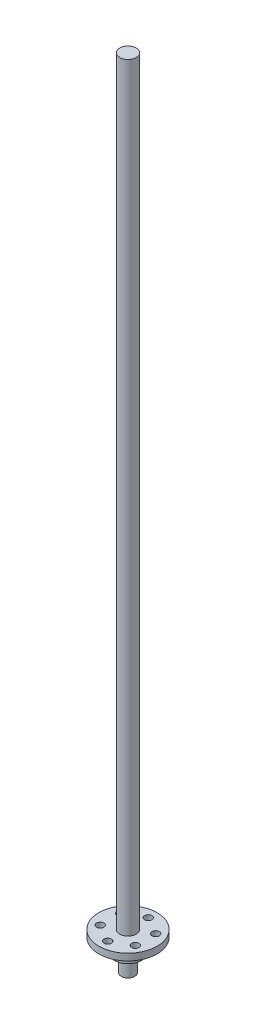
ISO-10303-21;
HEADER;
FILE_DESCRIPTION(('STEP AP214'),'2;1');
FILE_NAME('part.step','',(''),(''),'','','');
FILE_SCHEMA(('AUTOMOTIVE_DESIGN { 1 0 10303 214 1 1 1 1 }'));
ENDSEC;
DATA;
#1=APPLICATION_CONTEXT('core data for automotive mechanical design processes');
#2=APPLICATION_PROTOCOL_DEFINITION('international standard','automotive_design',2000,#1);
#3=PRODUCT_CONTEXT('',#1,'mechanical');
#4=PRODUCT('Part','Part','',(#3));
#5=PRODUCT_RELATED_PRODUCT_CATEGORY('part','',(#4));
#6=PRODUCT_DEFINITION_FORMATION('','',#4);
#7=PRODUCT_DEFINITION_CONTEXT('part definition',#1,'design');
#8=PRODUCT_DEFINITION('design','',#6,#7);
#9=PRODUCT_DEFINITION_SHAPE('','',#8);
#10=(LENGTH_UNIT() NAMED_UNIT(*) SI_UNIT(.MILLI.,.METRE.));
#11=(NAMED_UNIT(*) PLANE_ANGLE_UNIT() SI_UNIT($,.RADIAN.));
#12=(NAMED_UNIT(*) SI_UNIT($,.STERADIAN.) SOLID_ANGLE_UNIT());
#13=UNCERTAINTY_MEASURE_WITH_UNIT(LENGTH_MEASURE(1.E-05),#10,'distance_accuracy_value','');
#14=(GEOMETRIC_REPRESENTATION_CONTEXT(3) GLOBAL_UNCERTAINTY_ASSIGNED_CONTEXT((#13)) GLOBAL_UNIT_ASSIGNED_CONTEXT((#10,
#11,#12)) REPRESENTATION_CONTEXT('',''));
#15=CARTESIAN_POINT('',(0.,0.,0.));
#16=DIRECTION('',(0.,0.,1.));
#17=DIRECTION('',(1.,0.,0.));
#18=AXIS2_PLACEMENT_3D('',#15,#16,#17);
#19=CARTESIAN_POINT('',(0.,-12.,0.));
#20=DIRECTION('',(0.,-1.,0.));
#21=DIRECTION('',(0.,0.,-1.));
#22=AXIS2_PLACEMENT_3D('',#19,#20,#21);
#23=PLANE('',#22);
#24=CARTESIAN_POINT('',(0.,-12.,0.));
#25=DIRECTION('',(0.,-1.,0.));
#26=DIRECTION('',(0.,0.,-1.));
#27=AXIS2_PLACEMENT_3D('',#24,#25,#26);
#28=CIRCLE('',#27,12.91);
#29=CARTESIAN_POINT('',(0.,-12.,-12.91));
#30=VERTEX_POINT('',#29);
#31=EDGE_CURVE('E50',#30,#30,#28,.T.);
#32=ORIENTED_EDGE('',*,*,#31,.T.);
#33=EDGE_LOOP('',(#32));
#34=FACE_BOUND('',#33,.T.);
#35=CARTESIAN_POINT('',(0.,-12.,0.));
#36=DIRECTION('',(0.,-1.,0.));
#37=DIRECTION('',(0.,0.,-1.));
#38=AXIS2_PLACEMENT_3D('',#35,#36,#37);
#39=CIRCLE('',#38,6.26);
#40=CARTESIAN_POINT('',(0.,-12.,-6.26));
#41=VERTEX_POINT('',#40);
#42=EDGE_CURVE('E247',#41,#41,#39,.T.);
#43=ORIENTED_EDGE('',*,*,#42,.F.);
#44=EDGE_LOOP('',(#43));
#45=FACE_BOUND('',#44,.T.);
#46=ADVANCED_FACE('F30',(#34,#45),#23,.T.);
#47=CARTESIAN_POINT('',(0.,0.,0.));
#48=DIRECTION('',(0.,1.,0.));
#49=DIRECTION('',(0.,0.,1.));
#50=AXIS2_PLACEMENT_3D('',#47,#48,#49);
#51=PLANE('',#50);
#52=CARTESIAN_POINT('',(16.2104354120984,0.,-9.35909924885633));
#53=DIRECTION('',(0.,-1.,0.));
#54=DIRECTION('',(0.866025403784433,0.,-0.50000000000001));
#55=AXIS2_PLACEMENT_3D('',#52,#53,#54);
#56=CIRCLE('',#55,3.39461809094063);
#57=CARTESIAN_POINT('',(19.1502609149992,0.,-11.0564082943267));
#58=VERTEX_POINT('',#57);
#59=EDGE_CURVE('E75',#58,#58,#56,.T.);
#60=ORIENTED_EDGE('',*,*,#59,.F.);
#61=EDGE_LOOP('',(#60));
#62=FACE_BOUND('',#61,.T.);
#63=CARTESIAN_POINT('',(16.2104354120986,0.,9.35909924885599));
#64=DIRECTION('',(0.,-1.,0.));
#65=DIRECTION('',(0.866025403784443,0.,0.499999999999992));
#66=AXIS2_PLACEMENT_3D('',#63,#64,#65);
#67=CIRCLE('',#66,3.39461809094063);
#68=CARTESIAN_POINT('',(19.1502609149995,0.,11.0564082943263));
#69=VERTEX_POINT('',#68);
#70=EDGE_CURVE('E65',#69,#69,#67,.T.);
#71=ORIENTED_EDGE('',*,*,#70,.F.);
#72=EDGE_LOOP('',(#71));
#73=FACE_BOUND('',#72,.T.);
#74=CARTESIAN_POINT('',(0.,0.,18.7181984977123));
#75=DIRECTION('',(0.,-1.,0.));
#76=DIRECTION('',(0.,0.,1.));
#77=AXIS2_PLACEMENT_3D('',#74,#75,#76);
#78=CIRCLE('',#77,3.39461809094063);
#79=CARTESIAN_POINT('',(0.,0.,22.1128165886529));
#80=VERTEX_POINT('',#79);
#81=EDGE_CURVE('E62',#80,#80,#78,.T.);
#82=ORIENTED_EDGE('',*,*,#81,.F.);
#83=EDGE_LOOP('',(#82));
#84=FACE_BOUND('',#83,.T.);
#85=CARTESIAN_POINT('',(-16.2104354120985,0.,9.35909924885622));
#86=DIRECTION('',(0.,-1.,0.));
#87=DIRECTION('',(-0.866025403784436,0.,0.500000000000004));
#88=AXIS2_PLACEMENT_3D('',#85,#86,#87);
#89=CIRCLE('',#88,3.39461809094063);
#90=CARTESIAN_POINT('',(-19.1502609149993,0.,11.0564082943265));
#91=VERTEX_POINT('',#90);
#92=EDGE_CURVE('E59',#91,#91,#89,.T.);
#93=ORIENTED_EDGE('',*,*,#92,.F.);
#94=EDGE_LOOP('',(#93));
#95=FACE_BOUND('',#94,.T.);
#96=CARTESIAN_POINT('',(-16.2104354120986,0.,-9.3590992488561));
#97=DIRECTION('',(0.,-1.,0.));
#98=DIRECTION('',(-0.86602540378444,0.,-0.499999999999998));
#99=AXIS2_PLACEMENT_3D('',#96,#97,#98);
#100=CIRCLE('',#99,3.39461809094063);
#101=CARTESIAN_POINT('',(-19.1502609149994,0.,-11.0564082943264));
#102=VERTEX_POINT('',#101);
#103=EDGE_CURVE('E55',#102,#102,#100,.T.);
#104=ORIENTED_EDGE('',*,*,#103,.F.);
#105=EDGE_LOOP('',(#104));
#106=FACE_BOUND('',#105,.T.);
#107=CARTESIAN_POINT('',(0.,0.,-18.7181984977123));
#108=DIRECTION('',(0.,-1.,0.));
#109=DIRECTION('',(0.,0.,-1.));
#110=AXIS2_PLACEMENT_3D('',#107,#108,#109);
#111=CIRCLE('',#110,3.39461809094063);
#112=CARTESIAN_POINT('',(0.,0.,-22.1128165886529));
#113=VERTEX_POINT('',#112);
#114=EDGE_CURVE('E51',#113,#113,#111,.T.);
#115=ORIENTED_EDGE('',*,*,#114,.F.);
#116=EDGE_LOOP('',(#115));
#117=FACE_BOUND('',#116,.T.);
#118=CARTESIAN_POINT('',(0.,0.,0.));
#119=DIRECTION('',(0.,1.,0.));
#120=DIRECTION('',(0.,0.,1.));
#121=AXIS2_PLACEMENT_3D('',#118,#119,#120);
#122=CIRCLE('',#121,26.845);
#123=CARTESIAN_POINT('',(0.,0.,26.845));
#124=VERTEX_POINT('',#123);
#125=EDGE_CURVE('E43',#124,#124,#122,.T.);
#126=ORIENTED_EDGE('',*,*,#125,.F.);
#127=EDGE_LOOP('',(#126));
#128=FACE_BOUND('',#127,.T.);
#129=CARTESIAN_POINT('',(0.,0.,0.));
#130=DIRECTION('',(0.,1.,0.));
#131=DIRECTION('',(0.,0.,1.));
#132=AXIS2_PLACEMENT_3D('',#129,#130,#131);
#133=CIRCLE('',#132,12.91);
#134=CARTESIAN_POINT('',(0.,0.,12.91));
#135=VERTEX_POINT('',#134);
#136=EDGE_CURVE('E10',#135,#135,#133,.F.);
#137=ORIENTED_EDGE('',*,*,#136,.F.);
#138=EDGE_LOOP('',(#137));
#139=FACE_BOUND('',#138,.T.);
#140=ADVANCED_FACE('F98',(#62,#73,#84,#95,#106,#117,#128,#139),#51,.F.);
#141=CARTESIAN_POINT('',(0.,6.23,0.));
#142=DIRECTION('',(0.,1.,0.));
#143=DIRECTION('',(0.,0.,1.));
#144=AXIS2_PLACEMENT_3D('',#141,#142,#143);
#145=PLANE('',#144);
#146=CARTESIAN_POINT('',(16.2104354120984,6.23,-9.35909924885633));
#147=DIRECTION('',(0.,1.,0.));
#148=DIRECTION('',(0.,0.,1.));
#149=AXIS2_PLACEMENT_3D('',#146,#147,#148);
#150=CIRCLE('',#149,3.39461809094063);
#151=CARTESIAN_POINT('',(16.2104354120984,6.23,-5.9644811579157));
#152=VERTEX_POINT('',#151);
#153=EDGE_CURVE('E34',#152,#152,#150,.T.);
#154=ORIENTED_EDGE('',*,*,#153,.F.);
#155=EDGE_LOOP('',(#154));
#156=FACE_BOUND('',#155,.T.);
#157=CARTESIAN_POINT('',(16.2104354120986,6.23,9.35909924885599));
#158=DIRECTION('',(0.,1.,0.));
#159=DIRECTION('',(0.,0.,1.));
#160=AXIS2_PLACEMENT_3D('',#157,#158,#159);
#161=CIRCLE('',#160,3.39461809094063);
#162=CARTESIAN_POINT('',(16.2104354120986,6.23,12.7537173397966));
#163=VERTEX_POINT('',#162);
#164=EDGE_CURVE('E63',#163,#163,#161,.T.);
#165=ORIENTED_EDGE('',*,*,#164,.F.);
#166=EDGE_LOOP('',(#165));
#167=FACE_BOUND('',#166,.T.);
#168=CARTESIAN_POINT('',(0.,6.23,18.7181984977123));
#169=DIRECTION('',(0.,1.,0.));
#170=DIRECTION('',(0.,0.,1.));
#171=AXIS2_PLACEMENT_3D('',#168,#169,#170);
#172=CIRCLE('',#171,3.39461809094063);
#173=CARTESIAN_POINT('',(0.,6.23,22.1128165886529));
#174=VERTEX_POINT('',#173);
#175=EDGE_CURVE('E60',#174,#174,#172,.T.);
#176=ORIENTED_EDGE('',*,*,#175,.F.);
#177=EDGE_LOOP('',(#176));
#178=FACE_BOUND('',#177,.T.);
#179=CARTESIAN_POINT('',(-16.2104354120985,6.23,9.35909924885622));
#180=DIRECTION('',(0.,1.,0.));
#181=DIRECTION('',(0.,0.,1.));
#182=AXIS2_PLACEMENT_3D('',#179,#180,#181);
#183=CIRCLE('',#182,3.39461809094063);
#184=CARTESIAN_POINT('',(-16.2104354120985,6.23,12.7537173397968));
#185=VERTEX_POINT('',#184);
#186=EDGE_CURVE('E56',#185,#185,#183,.T.);
#187=ORIENTED_EDGE('',*,*,#186,.F.);
#188=EDGE_LOOP('',(#187));
#189=FACE_BOUND('',#188,.T.);
#190=CARTESIAN_POINT('',(-16.2104354120986,6.23,-9.3590992488561));
#191=DIRECTION('',(0.,1.,0.));
#192=DIRECTION('',(0.,0.,1.));
#193=AXIS2_PLACEMENT_3D('',#190,#191,#192);
#194=CIRCLE('',#193,3.39461809094063);
#195=CARTESIAN_POINT('',(-16.2104354120986,6.23,-5.96448115791548));
#196=VERTEX_POINT('',#195);
#197=EDGE_CURVE('E52',#196,#196,#194,.T.);
#198=ORIENTED_EDGE('',*,*,#197,.F.);
#199=EDGE_LOOP('',(#198));
#200=FACE_BOUND('',#199,.T.);
#201=CARTESIAN_POINT('',(0.,6.23,-18.7181984977123));
#202=DIRECTION('',(0.,1.,0.));
#203=DIRECTION('',(0.,0.,1.));
#204=AXIS2_PLACEMENT_3D('',#201,#202,#203);
#205=CIRCLE('',#204,3.39461809094063);
#206=CARTESIAN_POINT('',(0.,6.23,-15.3235804067717));
#207=VERTEX_POINT('',#206);
#208=EDGE_CURVE('E47',#207,#207,#205,.T.);
#209=ORIENTED_EDGE('',*,*,#208,.F.);
#210=EDGE_LOOP('',(#209));
#211=FACE_BOUND('',#210,.T.);
#212=CARTESIAN_POINT('',(0.,6.23,0.));
#213=DIRECTION('',(0.,1.,0.));
#214=DIRECTION('',(0.,0.,1.));
#215=AXIS2_PLACEMENT_3D('',#212,#213,#214);
#216=CIRCLE('',#215,26.845);
#217=CARTESIAN_POINT('',(0.,6.23,26.845));
#218=VERTEX_POINT('',#217);
#219=EDGE_CURVE('E38',#218,#218,#216,.T.);
#220=ORIENTED_EDGE('',*,*,#219,.T.);
#221=EDGE_LOOP('',(#220));
#222=FACE_BOUND('',#221,.T.);
#223=CARTESIAN_POINT('',(0.,6.23,0.));
#224=DIRECTION('',(0.,1.,0.));
#225=DIRECTION('',(0.,0.,1.));
#226=AXIS2_PLACEMENT_3D('',#223,#224,#225);
#227=CIRCLE('',#226,7.625);
#228=CARTESIAN_POINT('',(0.,6.23,7.625));
#229=VERTEX_POINT('',#228);
#230=EDGE_CURVE('E87',#229,#229,#227,.T.);
#231=ORIENTED_EDGE('',*,*,#230,.F.);
#232=EDGE_LOOP('',(#231));
#233=FACE_BOUND('',#232,.T.);
#234=ADVANCED_FACE('F96',(#156,#167,#178,#189,#200,#211,#222,#233),#145,.T.);
#235=CARTESIAN_POINT('',(0.,6.23,0.));
#236=DIRECTION('',(0.,-1.,0.));
#237=DIRECTION('',(0.,0.,-1.));
#238=AXIS2_PLACEMENT_3D('',#235,#236,#237);
#239=CYLINDRICAL_SURFACE('',#238,26.845);
#240=ORIENTED_EDGE('',*,*,#219,.F.);
#241=EDGE_LOOP('',(#240));
#242=FACE_BOUND('',#241,.T.);
#243=ORIENTED_EDGE('',*,*,#125,.T.);
#244=EDGE_LOOP('',(#243));
#245=FACE_BOUND('',#244,.T.);
#246=ADVANCED_FACE('F32',(#242,#245),#239,.T.);
#247=CARTESIAN_POINT('',(0.,706.23,0.));
#248=DIRECTION('',(0.,-1.,0.));
#249=DIRECTION('',(0.,0.,-1.));
#250=AXIS2_PLACEMENT_3D('',#247,#248,#249);
#251=CYLINDRICAL_SURFACE('',#250,7.625);
#252=CARTESIAN_POINT('',(0.,706.23,0.));
#253=DIRECTION('',(0.,1.,0.));
#254=DIRECTION('',(0.,0.,1.));
#255=AXIS2_PLACEMENT_3D('',#252,#253,#254);
#256=CIRCLE('',#255,7.625);
#257=CARTESIAN_POINT('',(0.,706.23,7.625));
#258=VERTEX_POINT('',#257);
#259=EDGE_CURVE('E88',#258,#258,#256,.T.);
#260=ORIENTED_EDGE('',*,*,#259,.F.);
#261=EDGE_LOOP('',(#260));
#262=FACE_BOUND('',#261,.T.);
#263=ORIENTED_EDGE('',*,*,#230,.T.);
#264=EDGE_LOOP('',(#263));
#265=FACE_BOUND('',#264,.T.);
#266=ADVANCED_FACE('F94',(#262,#265),#251,.T.);
#267=CARTESIAN_POINT('',(0.,706.23,0.));
#268=DIRECTION('',(0.,1.,0.));
#269=DIRECTION('',(0.,0.,1.));
#270=AXIS2_PLACEMENT_3D('',#267,#268,#269);
#271=PLANE('',#270);
#272=ORIENTED_EDGE('',*,*,#259,.T.);
#273=EDGE_LOOP('',(#272));
#274=FACE_BOUND('',#273,.T.);
#275=ADVANCED_FACE('F123',(#274),#271,.T.);
#276=CARTESIAN_POINT('',(0.,-12.,0.));
#277=DIRECTION('',(0.,1.,0.));
#278=DIRECTION('',(0.,0.,1.));
#279=AXIS2_PLACEMENT_3D('',#276,#277,#278);
#280=CYLINDRICAL_SURFACE('',#279,12.91);
#281=ORIENTED_EDGE('',*,*,#31,.F.);
#282=EDGE_LOOP('',(#281));
#283=FACE_BOUND('',#282,.T.);
#284=ORIENTED_EDGE('',*,*,#136,.T.);
#285=EDGE_LOOP('',(#284));
#286=FACE_BOUND('',#285,.T.);
#287=ADVANCED_FACE('F120',(#283,#286),#280,.T.);
#288=CARTESIAN_POINT('',(0.,12.,-18.7181984977123));
#289=DIRECTION('',(0.,-1.,0.));
#290=DIRECTION('',(0.,0.,-1.));
#291=AXIS2_PLACEMENT_3D('',#288,#289,#290);
#292=CYLINDRICAL_SURFACE('',#291,3.39461809094063);
#293=ORIENTED_EDGE('',*,*,#208,.T.);
#294=EDGE_LOOP('',(#293));
#295=FACE_BOUND('',#294,.T.);
#296=ORIENTED_EDGE('',*,*,#114,.T.);
#297=EDGE_LOOP('',(#296));
#298=FACE_BOUND('',#297,.T.);
#299=ADVANCED_FACE('F118',(#295,#298),#292,.F.);
#300=CARTESIAN_POINT('',(-16.2104354120986,12.,-9.3590992488561));
#301=DIRECTION('',(0.,-1.,0.));
#302=DIRECTION('',(0.,0.,-1.));
#303=AXIS2_PLACEMENT_3D('',#300,#301,#302);
#304=CYLINDRICAL_SURFACE('',#303,3.39461809094063);
#305=ORIENTED_EDGE('',*,*,#197,.T.);
#306=EDGE_LOOP('',(#305));
#307=FACE_BOUND('',#306,.T.);
#308=ORIENTED_EDGE('',*,*,#103,.T.);
#309=EDGE_LOOP('',(#308));
#310=FACE_BOUND('',#309,.T.);
#311=ADVANCED_FACE('F148',(#307,#310),#304,.F.);
#312=CARTESIAN_POINT('',(-16.2104354120985,12.,9.35909924885622));
#313=DIRECTION('',(0.,-1.,0.));
#314=DIRECTION('',(0.,0.,-1.));
#315=AXIS2_PLACEMENT_3D('',#312,#313,#314);
#316=CYLINDRICAL_SURFACE('',#315,3.39461809094063);
#317=ORIENTED_EDGE('',*,*,#186,.T.);
#318=EDGE_LOOP('',(#317));
#319=FACE_BOUND('',#318,.T.);
#320=ORIENTED_EDGE('',*,*,#92,.T.);
#321=EDGE_LOOP('',(#320));
#322=FACE_BOUND('',#321,.T.);
#323=ADVANCED_FACE('F156',(#319,#322),#316,.F.);
#324=CARTESIAN_POINT('',(0.,12.,18.7181984977123));
#325=DIRECTION('',(0.,-1.,0.));
#326=DIRECTION('',(0.,0.,-1.));
#327=AXIS2_PLACEMENT_3D('',#324,#325,#326);
#328=CYLINDRICAL_SURFACE('',#327,3.39461809094063);
#329=ORIENTED_EDGE('',*,*,#175,.T.);
#330=EDGE_LOOP('',(#329));
#331=FACE_BOUND('',#330,.T.);
#332=ORIENTED_EDGE('',*,*,#81,.T.);
#333=EDGE_LOOP('',(#332));
#334=FACE_BOUND('',#333,.T.);
#335=ADVANCED_FACE('F163',(#331,#334),#328,.F.);
#336=CARTESIAN_POINT('',(16.2104354120986,12.,9.35909924885599));
#337=DIRECTION('',(0.,-1.,0.));
#338=DIRECTION('',(0.,0.,-1.));
#339=AXIS2_PLACEMENT_3D('',#336,#337,#338);
#340=CYLINDRICAL_SURFACE('',#339,3.39461809094063);
#341=ORIENTED_EDGE('',*,*,#164,.T.);
#342=EDGE_LOOP('',(#341));
#343=FACE_BOUND('',#342,.T.);
#344=ORIENTED_EDGE('',*,*,#70,.T.);
#345=EDGE_LOOP('',(#344));
#346=FACE_BOUND('',#345,.T.);
#347=ADVANCED_FACE('F171',(#343,#346),#340,.F.);
#348=CARTESIAN_POINT('',(16.2104354120984,12.,-9.35909924885633));
#349=DIRECTION('',(0.,-1.,0.));
#350=DIRECTION('',(0.,0.,-1.));
#351=AXIS2_PLACEMENT_3D('',#348,#349,#350);
#352=CYLINDRICAL_SURFACE('',#351,3.39461809094063);
#353=ORIENTED_EDGE('',*,*,#153,.T.);
#354=EDGE_LOOP('',(#353));
#355=FACE_BOUND('',#354,.T.);
#356=ORIENTED_EDGE('',*,*,#59,.T.);
#357=EDGE_LOOP('',(#356));
#358=FACE_BOUND('',#357,.T.);
#359=ADVANCED_FACE('F179',(#355,#358),#352,.F.);
#360=CARTESIAN_POINT('',(0.,-28.13,0.));
#361=DIRECTION('',(0.,1.,0.));
#362=DIRECTION('',(0.,0.,1.));
#363=AXIS2_PLACEMENT_3D('',#360,#361,#362);
#364=CYLINDRICAL_SURFACE('',#363,6.26);
#365=CARTESIAN_POINT('',(0.,-28.13,0.));
#366=DIRECTION('',(0.,-1.,0.));
#367=DIRECTION('',(0.,0.,-1.));
#368=AXIS2_PLACEMENT_3D('',#365,#366,#367);
#369=CIRCLE('',#368,6.26);
#370=CARTESIAN_POINT('',(0.,-28.13,-6.26));
#371=VERTEX_POINT('',#370);
#372=EDGE_CURVE('E246',#371,#371,#369,.T.);
#373=ORIENTED_EDGE('',*,*,#372,.F.);
#374=EDGE_LOOP('',(#373));
#375=FACE_BOUND('',#374,.T.);
#376=ORIENTED_EDGE('',*,*,#42,.T.);
#377=EDGE_LOOP('',(#376));
#378=FACE_BOUND('',#377,.T.);
#379=ADVANCED_FACE('F186',(#375,#378),#364,.T.);
#380=CARTESIAN_POINT('',(0.,-28.13,0.));
#381=DIRECTION('',(0.,-1.,0.));
#382=DIRECTION('',(0.,0.,-1.));
#383=AXIS2_PLACEMENT_3D('',#380,#381,#382);
#384=PLANE('',#383);
#385=ORIENTED_EDGE('',*,*,#372,.T.);
#386=EDGE_LOOP('',(#385));
#387=FACE_BOUND('',#386,.T.);
#388=ADVANCED_FACE('F194',(#387),#384,.T.);
#389=CLOSED_SHELL('',(#46,#140,#234,#246,#266,#275,#287,#299,#311,#323,#335,#347,#359,#379,#388));
#390=MANIFOLD_SOLID_BREP('B2',#389);
#391=ADVANCED_BREP_SHAPE_REPRESENTATION('',(#18,#390),#14);
#392=SHAPE_DEFINITION_REPRESENTATION(#9,#391);
ENDSEC;
END-ISO-10303-21;
